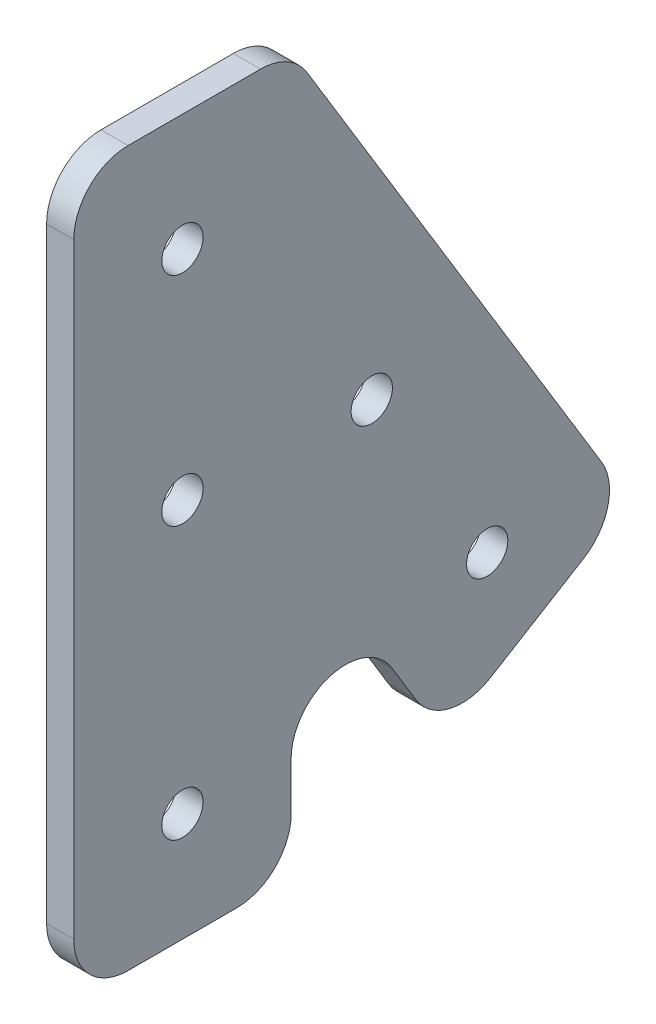
ISO-10303-21;
HEADER;
FILE_DESCRIPTION(('STEP AP214'),'2;1');
FILE_NAME('part.step','',(''),(''),'','','');
FILE_SCHEMA(('AUTOMOTIVE_DESIGN { 1 0 10303 214 1 1 1 1 }'));
ENDSEC;
DATA;
#1=APPLICATION_CONTEXT('core data for automotive mechanical design processes');
#2=APPLICATION_PROTOCOL_DEFINITION('international standard','automotive_design',2000,#1);
#3=PRODUCT_CONTEXT('',#1,'mechanical');
#4=PRODUCT('Part','Part','',(#3));
#5=PRODUCT_RELATED_PRODUCT_CATEGORY('part','',(#4));
#6=PRODUCT_DEFINITION_FORMATION('','',#4);
#7=PRODUCT_DEFINITION_CONTEXT('part definition',#1,'design');
#8=PRODUCT_DEFINITION('design','',#6,#7);
#9=PRODUCT_DEFINITION_SHAPE('','',#8);
#10=(LENGTH_UNIT() NAMED_UNIT(*) SI_UNIT(.MILLI.,.METRE.));
#11=(NAMED_UNIT(*) PLANE_ANGLE_UNIT() SI_UNIT($,.RADIAN.));
#12=(NAMED_UNIT(*) SI_UNIT($,.STERADIAN.) SOLID_ANGLE_UNIT());
#13=UNCERTAINTY_MEASURE_WITH_UNIT(LENGTH_MEASURE(1.E-05),#10,'distance_accuracy_value','');
#14=(GEOMETRIC_REPRESENTATION_CONTEXT(3) GLOBAL_UNCERTAINTY_ASSIGNED_CONTEXT((#13)) GLOBAL_UNIT_ASSIGNED_CONTEXT((#10,
#11,#12)) REPRESENTATION_CONTEXT('',''));
#15=CARTESIAN_POINT('',(0.,0.,0.));
#16=DIRECTION('',(0.,0.,1.));
#17=DIRECTION('',(1.,0.,0.));
#18=AXIS2_PLACEMENT_3D('',#15,#16,#17);
#19=CARTESIAN_POINT('',(3.175,13.9055201207131,-45.3988248074995));
#20=DIRECTION('',(-1.,0.,0.));
#21=DIRECTION('',(0.,0.,1.));
#22=AXIS2_PLACEMENT_3D('',#19,#20,#21);
#23=CYLINDRICAL_SURFACE('',#22,6.35);
#24=CARTESIAN_POINT('',(0.,13.9055201207131,-45.3988248074995));
#25=DIRECTION('',(1.,0.,0.));
#26=DIRECTION('',(0.,0.,-1.));
#27=AXIS2_PLACEMENT_3D('',#24,#25,#26);
#28=CIRCLE('',#27,6.35);
#29=CARTESIAN_POINT('',(0.,10.6075207936335,-39.9724355440406));
#30=VERTEX_POINT('',#29);
#31=CARTESIAN_POINT('',(0.,8.47913085725418,-48.6968241345792));
#32=VERTEX_POINT('',#31);
#33=EDGE_CURVE('E165',#30,#32,#28,.T.);
#34=ORIENTED_EDGE('',*,*,#33,.T.);
#35=DIRECTION('',(-1.,0.,0.));
#36=VECTOR('',#35,1.);
#37=CARTESIAN_POINT('',(3.175,8.47913085725418,-48.6968241345792));
#38=LINE('',#37,#36);
#39=CARTESIAN_POINT('',(3.175,8.47913085725418,-48.6968241345792));
#40=VERTEX_POINT('',#39);
#41=EDGE_CURVE('E11',#40,#32,#38,.T.);
#42=ORIENTED_EDGE('',*,*,#41,.F.);
#43=CARTESIAN_POINT('',(3.175,13.9055201207131,-45.3988248074995));
#44=DIRECTION('',(1.,0.,0.));
#45=DIRECTION('',(0.,0.,-1.));
#46=AXIS2_PLACEMENT_3D('',#43,#44,#45);
#47=CIRCLE('',#46,6.35);
#48=CARTESIAN_POINT('',(3.175,10.6075207936335,-39.9724355440406));
#49=VERTEX_POINT('',#48);
#50=EDGE_CURVE('E192',#49,#40,#47,.T.);
#51=ORIENTED_EDGE('',*,*,#50,.F.);
#52=DIRECTION('',(-1.,0.,0.));
#53=VECTOR('',#52,1.);
#54=CARTESIAN_POINT('',(3.175,10.6075207936335,-39.9724355440406));
#55=LINE('',#54,#53);
#56=EDGE_CURVE('E161',#49,#30,#55,.T.);
#57=ORIENTED_EDGE('',*,*,#56,.T.);
#58=EDGE_LOOP('',(#34,#42,#51,#57));
#59=FACE_BOUND('',#58,.T.);
#60=ADVANCED_FACE('F33',(#59),#23,.T.);
#61=CARTESIAN_POINT('',(3.175,15.0751295114134,-59.5496026614969));
#62=DIRECTION('',(0.,0.854549490308491,0.519369972768448));
#63=DIRECTION('',(0.,-0.519369972768448,0.854549490308491));
#64=AXIS2_PLACEMENT_3D('',#61,#62,#63);
#65=PLANE('',#64);
#66=DIRECTION('',(0.,0.519369972768448,-0.854549490308491));
#67=VECTOR('',#66,1.);
#68=CARTESIAN_POINT('',(0.,15.0751295114134,-59.5496026614969));
#69=LINE('',#68,#67);
#70=CARTESIAN_POINT('',(0.,15.0751295114134,-59.5496026614969));
#71=VERTEX_POINT('',#70);
#72=EDGE_CURVE('E168',#32,#71,#69,.T.);
#73=ORIENTED_EDGE('',*,*,#72,.T.);
#74=DIRECTION('',(-1.,0.,0.));
#75=VECTOR('',#74,1.);
#76=CARTESIAN_POINT('',(3.175,15.0751295114134,-59.5496026614969));
#77=LINE('',#76,#75);
#78=CARTESIAN_POINT('',(3.175,15.0751295114134,-59.5496026614969));
#79=VERTEX_POINT('',#78);
#80=EDGE_CURVE('E41',#79,#71,#77,.T.);
#81=ORIENTED_EDGE('',*,*,#80,.F.);
#82=DIRECTION('',(0.,0.519369972768448,-0.854549490308491));
#83=VECTOR('',#82,1.);
#84=CARTESIAN_POINT('',(3.175,15.0751295114134,-59.5496026614969));
#85=LINE('',#84,#83);
#86=EDGE_CURVE('E110',#40,#79,#85,.T.);
#87=ORIENTED_EDGE('',*,*,#86,.F.);
#88=ORIENTED_EDGE('',*,*,#41,.T.);
#89=EDGE_LOOP('',(#73,#81,#87,#88));
#90=FACE_BOUND('',#89,.T.);
#91=ADVANCED_FACE('F281',(#90),#65,.F.);
#92=CARTESIAN_POINT('',(3.175,20.5015187748724,-56.2516033344173));
#93=DIRECTION('',(-1.,0.,0.));
#94=DIRECTION('',(0.,0.,1.));
#95=AXIS2_PLACEMENT_3D('',#92,#93,#94);
#96=CYLINDRICAL_SURFACE('',#95,6.35);
#97=CARTESIAN_POINT('',(0.,20.5015187748724,-56.2516033344173));
#98=DIRECTION('',(1.,0.,0.));
#99=DIRECTION('',(0.,0.,-1.));
#100=AXIS2_PLACEMENT_3D('',#97,#98,#99);
#101=CIRCLE('',#100,6.35);
#102=CARTESIAN_POINT('',(0.,23.7995181019521,-61.6779925978762));
#103=VERTEX_POINT('',#102);
#104=EDGE_CURVE('E171',#71,#103,#101,.T.);
#105=ORIENTED_EDGE('',*,*,#104,.T.);
#106=DIRECTION('',(-1.,0.,0.));
#107=VECTOR('',#106,1.);
#108=CARTESIAN_POINT('',(3.175,23.7995181019521,-61.6779925978762));
#109=LINE('',#108,#107);
#110=CARTESIAN_POINT('',(3.175,23.7995181019521,-61.6779925978762));
#111=VERTEX_POINT('',#110);
#112=EDGE_CURVE('E217',#111,#103,#109,.T.);
#113=ORIENTED_EDGE('',*,*,#112,.F.);
#114=CARTESIAN_POINT('',(3.175,20.5015187748724,-56.2516033344173));
#115=DIRECTION('',(1.,0.,0.));
#116=DIRECTION('',(0.,0.,-1.));
#117=AXIS2_PLACEMENT_3D('',#114,#115,#116);
#118=CIRCLE('',#117,6.35);
#119=EDGE_CURVE('E225',#79,#111,#118,.T.);
#120=ORIENTED_EDGE('',*,*,#119,.F.);
#121=ORIENTED_EDGE('',*,*,#80,.T.);
#122=EDGE_LOOP('',(#105,#113,#120,#121));
#123=FACE_BOUND('',#122,.T.);
#124=ADVANCED_FACE('F223',(#123),#96,.T.);
#125=CARTESIAN_POINT('',(3.175,80.4377993270796,-27.2549159812988));
#126=DIRECTION('',(0.,-0.51936997276845,0.854549490308489));
#127=DIRECTION('',(0.,-0.85454949030849,-0.51936997276845));
#128=AXIS2_PLACEMENT_3D('',#125,#126,#127);
#129=PLANE('',#128);
#130=DIRECTION('',(0.,0.854549490308489,0.51936997276845));
#131=VECTOR('',#130,1.);
#132=CARTESIAN_POINT('',(0.,80.4377993270796,-27.2549159812988));
#133=LINE('',#132,#131);
#134=CARTESIAN_POINT('',(0.,80.4377993270796,-27.2549159812988));
#135=VERTEX_POINT('',#134);
#136=EDGE_CURVE('E173',#103,#135,#133,.T.);
#137=ORIENTED_EDGE('',*,*,#136,.T.);
#138=DIRECTION('',(-1.,0.,0.));
#139=VECTOR('',#138,1.);
#140=CARTESIAN_POINT('',(3.175,80.4377993270796,-27.2549159812988));
#141=LINE('',#140,#139);
#142=CARTESIAN_POINT('',(3.175,80.4377993270796,-27.2549159812988));
#143=VERTEX_POINT('',#142);
#144=EDGE_CURVE('E214',#143,#135,#141,.T.);
#145=ORIENTED_EDGE('',*,*,#144,.F.);
#146=DIRECTION('',(0.,0.854549490308489,0.51936997276845));
#147=VECTOR('',#146,1.);
#148=CARTESIAN_POINT('',(3.175,80.4377993270796,-27.2549159812988));
#149=LINE('',#148,#147);
#150=EDGE_CURVE('E243',#111,#143,#149,.T.);
#151=ORIENTED_EDGE('',*,*,#150,.F.);
#152=ORIENTED_EDGE('',*,*,#112,.T.);
#153=EDGE_LOOP('',(#137,#145,#151,#152));
#154=FACE_BOUND('',#153,.T.);
#155=ADVANCED_FACE('F234',(#154),#129,.F.);
#156=CARTESIAN_POINT('',(3.175,77.1398,-21.8285267178398));
#157=DIRECTION('',(-1.,0.,0.));
#158=DIRECTION('',(0.,0.,1.));
#159=AXIS2_PLACEMENT_3D('',#156,#157,#158);
#160=CYLINDRICAL_SURFACE('',#159,6.35);
#161=CARTESIAN_POINT('',(0.,77.1398,-21.8285267178398));
#162=DIRECTION('',(1.,0.,0.));
#163=DIRECTION('',(0.,0.,-1.));
#164=AXIS2_PLACEMENT_3D('',#161,#162,#163);
#165=CIRCLE('',#164,6.35);
#166=CARTESIAN_POINT('',(0.,83.4898,-21.8285267178398));
#167=VERTEX_POINT('',#166);
#168=EDGE_CURVE('E175',#135,#167,#165,.T.);
#169=ORIENTED_EDGE('',*,*,#168,.T.);
#170=DIRECTION('',(-1.,0.,0.));
#171=VECTOR('',#170,1.);
#172=CARTESIAN_POINT('',(3.175,83.4898,-21.8285267178398));
#173=LINE('',#172,#171);
#174=CARTESIAN_POINT('',(3.175,83.4898,-21.8285267178398));
#175=VERTEX_POINT('',#174);
#176=EDGE_CURVE('E211',#175,#167,#173,.T.);
#177=ORIENTED_EDGE('',*,*,#176,.F.);
#178=CARTESIAN_POINT('',(3.175,77.1398,-21.8285267178398));
#179=DIRECTION('',(1.,0.,0.));
#180=DIRECTION('',(0.,0.,-1.));
#181=AXIS2_PLACEMENT_3D('',#178,#179,#180);
#182=CIRCLE('',#181,6.35);
#183=EDGE_CURVE('E240',#143,#175,#182,.T.);
#184=ORIENTED_EDGE('',*,*,#183,.F.);
#185=ORIENTED_EDGE('',*,*,#144,.T.);
#186=EDGE_LOOP('',(#169,#177,#184,#185));
#187=FACE_BOUND('',#186,.T.);
#188=ADVANCED_FACE('F238',(#187),#160,.T.);
#189=CARTESIAN_POINT('',(3.175,83.4898,-6.35000000000004));
#190=DIRECTION('',(0.,-1.,0.));
#191=DIRECTION('',(0.,0.,-1.));
#192=AXIS2_PLACEMENT_3D('',#189,#190,#191);
#193=PLANE('',#192);
#194=DIRECTION('',(0.,0.,1.));
#195=VECTOR('',#194,1.);
#196=CARTESIAN_POINT('',(0.,83.4898,-6.35000000000004));
#197=LINE('',#196,#195);
#198=CARTESIAN_POINT('',(0.,83.4898,-6.35000000000004));
#199=VERTEX_POINT('',#198);
#200=EDGE_CURVE('E177',#167,#199,#197,.T.);
#201=ORIENTED_EDGE('',*,*,#200,.T.);
#202=DIRECTION('',(-1.,0.,0.));
#203=VECTOR('',#202,1.);
#204=CARTESIAN_POINT('',(3.175,83.4898,-6.35000000000004));
#205=LINE('',#204,#203);
#206=CARTESIAN_POINT('',(3.175,83.4898,-6.35000000000004));
#207=VERTEX_POINT('',#206);
#208=EDGE_CURVE('E208',#207,#199,#205,.T.);
#209=ORIENTED_EDGE('',*,*,#208,.F.);
#210=DIRECTION('',(0.,0.,1.));
#211=VECTOR('',#210,1.);
#212=CARTESIAN_POINT('',(3.175,83.4898,-6.35000000000004));
#213=LINE('',#212,#211);
#214=EDGE_CURVE('E242',#175,#207,#213,.T.);
#215=ORIENTED_EDGE('',*,*,#214,.F.);
#216=ORIENTED_EDGE('',*,*,#176,.T.);
#217=EDGE_LOOP('',(#201,#209,#215,#216));
#218=FACE_BOUND('',#217,.T.);
#219=ADVANCED_FACE('F294',(#218),#193,.F.);
#220=CARTESIAN_POINT('',(3.175,77.1398,-6.35));
#221=DIRECTION('',(-1.,0.,0.));
#222=DIRECTION('',(0.,0.,1.));
#223=AXIS2_PLACEMENT_3D('',#220,#221,#222);
#224=CYLINDRICAL_SURFACE('',#223,6.35);
#225=CARTESIAN_POINT('',(0.,77.1398,-6.35));
#226=DIRECTION('',(1.,0.,0.));
#227=DIRECTION('',(0.,0.,-1.));
#228=AXIS2_PLACEMENT_3D('',#225,#226,#227);
#229=CIRCLE('',#228,6.35);
#230=CARTESIAN_POINT('',(0.,77.1397999999999,0.));
#231=VERTEX_POINT('',#230);
#232=EDGE_CURVE('E179',#199,#231,#229,.T.);
#233=ORIENTED_EDGE('',*,*,#232,.T.);
#234=DIRECTION('',(-1.,0.,0.));
#235=VECTOR('',#234,1.);
#236=CARTESIAN_POINT('',(3.175,77.1397999999999,0.));
#237=LINE('',#236,#235);
#238=CARTESIAN_POINT('',(3.175,77.1397999999999,0.));
#239=VERTEX_POINT('',#238);
#240=EDGE_CURVE('E205',#239,#231,#237,.T.);
#241=ORIENTED_EDGE('',*,*,#240,.F.);
#242=CARTESIAN_POINT('',(3.175,77.1398,-6.35));
#243=DIRECTION('',(1.,0.,0.));
#244=DIRECTION('',(0.,0.,-1.));
#245=AXIS2_PLACEMENT_3D('',#242,#243,#244);
#246=CIRCLE('',#245,6.35);
#247=EDGE_CURVE('E245',#207,#239,#246,.T.);
#248=ORIENTED_EDGE('',*,*,#247,.F.);
#249=ORIENTED_EDGE('',*,*,#208,.T.);
#250=EDGE_LOOP('',(#233,#241,#248,#249));
#251=FACE_BOUND('',#250,.T.);
#252=ADVANCED_FACE('F297',(#251),#224,.T.);
#253=CARTESIAN_POINT('',(3.175,6.35000000000004,0.));
#254=DIRECTION('',(0.,0.,-1.));
#255=DIRECTION('',(-1.,0.,0.));
#256=AXIS2_PLACEMENT_3D('',#253,#254,#255);
#257=PLANE('',#256);
#258=DIRECTION('',(0.,-1.,0.));
#259=VECTOR('',#258,1.);
#260=CARTESIAN_POINT('',(0.,6.35000000000004,0.));
#261=LINE('',#260,#259);
#262=CARTESIAN_POINT('',(0.,6.35,0.));
#263=VERTEX_POINT('',#262);
#264=EDGE_CURVE('E181',#231,#263,#261,.T.);
#265=ORIENTED_EDGE('',*,*,#264,.T.);
#266=DIRECTION('',(-1.,0.,0.));
#267=VECTOR('',#266,1.);
#268=CARTESIAN_POINT('',(3.175,6.35,0.));
#269=LINE('',#268,#267);
#270=CARTESIAN_POINT('',(3.175,6.35,0.));
#271=VERTEX_POINT('',#270);
#272=EDGE_CURVE('E202',#271,#263,#269,.T.);
#273=ORIENTED_EDGE('',*,*,#272,.F.);
#274=DIRECTION('',(0.,-1.,0.));
#275=VECTOR('',#274,1.);
#276=CARTESIAN_POINT('',(3.175,6.35000000000004,0.));
#277=LINE('',#276,#275);
#278=EDGE_CURVE('E251',#239,#271,#277,.T.);
#279=ORIENTED_EDGE('',*,*,#278,.F.);
#280=ORIENTED_EDGE('',*,*,#240,.T.);
#281=EDGE_LOOP('',(#265,#273,#279,#280));
#282=FACE_BOUND('',#281,.T.);
#283=ADVANCED_FACE('F301',(#282),#257,.F.);
#284=CARTESIAN_POINT('',(3.175,6.35,-6.35));
#285=DIRECTION('',(-1.,0.,0.));
#286=DIRECTION('',(0.,0.,1.));
#287=AXIS2_PLACEMENT_3D('',#284,#285,#286);
#288=CYLINDRICAL_SURFACE('',#287,6.35);
#289=CARTESIAN_POINT('',(0.,6.35,-6.35));
#290=DIRECTION('',(1.,0.,0.));
#291=DIRECTION('',(0.,0.,1.));
#292=AXIS2_PLACEMENT_3D('',#289,#290,#291);
#293=CIRCLE('',#292,6.35);
#294=CARTESIAN_POINT('',(0.,0.,-6.35000000000004));
#295=VERTEX_POINT('',#294);
#296=EDGE_CURVE('E183',#263,#295,#293,.T.);
#297=ORIENTED_EDGE('',*,*,#296,.T.);
#298=DIRECTION('',(-1.,0.,0.));
#299=VECTOR('',#298,1.);
#300=CARTESIAN_POINT('',(3.175,0.,-6.35000000000004));
#301=LINE('',#300,#299);
#302=CARTESIAN_POINT('',(3.175,0.,-6.35000000000004));
#303=VERTEX_POINT('',#302);
#304=EDGE_CURVE('E199',#303,#295,#301,.T.);
#305=ORIENTED_EDGE('',*,*,#304,.F.);
#306=CARTESIAN_POINT('',(3.175,6.35,-6.35));
#307=DIRECTION('',(1.,0.,0.));
#308=DIRECTION('',(0.,0.,1.));
#309=AXIS2_PLACEMENT_3D('',#306,#307,#308);
#310=CIRCLE('',#309,6.35);
#311=EDGE_CURVE('E253',#271,#303,#310,.T.);
#312=ORIENTED_EDGE('',*,*,#311,.F.);
#313=ORIENTED_EDGE('',*,*,#272,.T.);
#314=EDGE_LOOP('',(#297,#305,#312,#313));
#315=FACE_BOUND('',#314,.T.);
#316=ADVANCED_FACE('F305',(#315),#288,.T.);
#317=CARTESIAN_POINT('',(3.175,0.,-6.35000000000004));
#318=DIRECTION('',(0.,1.,0.));
#319=DIRECTION('',(0.,0.,1.));
#320=AXIS2_PLACEMENT_3D('',#317,#318,#319);
#321=PLANE('',#320);
#322=DIRECTION('',(0.,0.,-1.));
#323=VECTOR('',#322,1.);
#324=CARTESIAN_POINT('',(0.,0.,-6.35000000000004));
#325=LINE('',#324,#323);
#326=CARTESIAN_POINT('',(0.,0.,-19.05));
#327=VERTEX_POINT('',#326);
#328=EDGE_CURVE('E185',#295,#327,#325,.T.);
#329=ORIENTED_EDGE('',*,*,#328,.T.);
#330=DIRECTION('',(-1.,0.,0.));
#331=VECTOR('',#330,1.);
#332=CARTESIAN_POINT('',(3.175,0.,-19.05));
#333=LINE('',#332,#331);
#334=CARTESIAN_POINT('',(3.175,0.,-19.05));
#335=VERTEX_POINT('',#334);
#336=EDGE_CURVE('E196',#335,#327,#333,.T.);
#337=ORIENTED_EDGE('',*,*,#336,.F.);
#338=DIRECTION('',(0.,0.,-1.));
#339=VECTOR('',#338,1.);
#340=CARTESIAN_POINT('',(3.175,0.,-6.35000000000004));
#341=LINE('',#340,#339);
#342=EDGE_CURVE('E255',#303,#335,#341,.T.);
#343=ORIENTED_EDGE('',*,*,#342,.F.);
#344=ORIENTED_EDGE('',*,*,#304,.T.);
#345=EDGE_LOOP('',(#329,#337,#343,#344));
#346=FACE_BOUND('',#345,.T.);
#347=ADVANCED_FACE('F261',(#346),#321,.F.);
#348=CARTESIAN_POINT('',(3.175,6.35,-19.05));
#349=DIRECTION('',(-1.,0.,0.));
#350=DIRECTION('',(0.,0.,1.));
#351=AXIS2_PLACEMENT_3D('',#348,#349,#350);
#352=CYLINDRICAL_SURFACE('',#351,6.35);
#353=CARTESIAN_POINT('',(0.,6.35,-19.05));
#354=DIRECTION('',(1.,0.,0.));
#355=DIRECTION('',(0.,0.,-1.));
#356=AXIS2_PLACEMENT_3D('',#353,#354,#355);
#357=CIRCLE('',#356,6.35);
#358=CARTESIAN_POINT('',(0.,6.35000000000004,-25.4));
#359=VERTEX_POINT('',#358);
#360=EDGE_CURVE('E187',#327,#359,#357,.T.);
#361=ORIENTED_EDGE('',*,*,#360,.T.);
#362=DIRECTION('',(-1.,0.,0.));
#363=VECTOR('',#362,1.);
#364=CARTESIAN_POINT('',(3.175,6.35000000000004,-25.4));
#365=LINE('',#364,#363);
#366=CARTESIAN_POINT('',(3.175,6.35000000000004,-25.4));
#367=VERTEX_POINT('',#366);
#368=EDGE_CURVE('E156',#367,#359,#365,.T.);
#369=ORIENTED_EDGE('',*,*,#368,.F.);
#370=CARTESIAN_POINT('',(3.175,6.35,-19.05));
#371=DIRECTION('',(1.,0.,0.));
#372=DIRECTION('',(0.,0.,-1.));
#373=AXIS2_PLACEMENT_3D('',#370,#371,#372);
#374=CIRCLE('',#373,6.35);
#375=EDGE_CURVE('E147',#335,#367,#374,.T.);
#376=ORIENTED_EDGE('',*,*,#375,.F.);
#377=ORIENTED_EDGE('',*,*,#336,.T.);
#378=EDGE_LOOP('',(#361,#369,#376,#377));
#379=FACE_BOUND('',#378,.T.);
#380=ADVANCED_FACE('F265',(#379),#352,.T.);
#381=CARTESIAN_POINT('',(3.175,6.35000000000004,-25.4));
#382=DIRECTION('',(0.,0.,1.));
#383=DIRECTION('',(1.,0.,0.));
#384=AXIS2_PLACEMENT_3D('',#381,#382,#383);
#385=PLANE('',#384);
#386=DIRECTION('',(0.,1.,0.));
#387=VECTOR('',#386,1.);
#388=CARTESIAN_POINT('',(0.,6.35000000000004,-25.4));
#389=LINE('',#388,#387);
#390=CARTESIAN_POINT('',(0.,11.9100183170237,-25.4));
#391=VERTEX_POINT('',#390);
#392=EDGE_CURVE('E155',#359,#391,#389,.T.);
#393=ORIENTED_EDGE('',*,*,#392,.T.);
#394=DIRECTION('',(-1.,0.,0.));
#395=VECTOR('',#394,1.);
#396=CARTESIAN_POINT('',(3.175,11.9100183170237,-25.4));
#397=LINE('',#396,#395);
#398=CARTESIAN_POINT('',(3.175,11.9100183170237,-25.4));
#399=VERTEX_POINT('',#398);
#400=EDGE_CURVE('E152',#399,#391,#397,.T.);
#401=ORIENTED_EDGE('',*,*,#400,.F.);
#402=DIRECTION('',(0.,1.,0.));
#403=VECTOR('',#402,1.);
#404=CARTESIAN_POINT('',(3.175,6.35000000000004,-25.4));
#405=LINE('',#404,#403);
#406=EDGE_CURVE('E141',#367,#399,#405,.T.);
#407=ORIENTED_EDGE('',*,*,#406,.F.);
#408=ORIENTED_EDGE('',*,*,#368,.T.);
#409=EDGE_LOOP('',(#393,#401,#407,#408));
#410=FACE_BOUND('',#409,.T.);
#411=ADVANCED_FACE('F153',(#410),#385,.F.);
#412=CARTESIAN_POINT('',(3.175,11.910018317024,-31.75));
#413=DIRECTION('',(-1.,0.,0.));
#414=DIRECTION('',(0.,0.,1.));
#415=AXIS2_PLACEMENT_3D('',#412,#413,#414);
#416=CYLINDRICAL_SURFACE('',#415,6.35);
#417=CARTESIAN_POINT('',(0.,11.910018317024,-31.75));
#418=DIRECTION('',(-1.,0.,0.));
#419=DIRECTION('',(0.,0.,-1.));
#420=AXIS2_PLACEMENT_3D('',#417,#418,#419);
#421=CIRCLE('',#420,6.35);
#422=CARTESIAN_POINT('',(0.,15.2080176441034,-37.1763892634591));
#423=VERTEX_POINT('',#422);
#424=EDGE_CURVE('E96',#391,#423,#421,.T.);
#425=ORIENTED_EDGE('',*,*,#424,.T.);
#426=DIRECTION('',(-1.,0.,0.));
#427=VECTOR('',#426,1.);
#428=CARTESIAN_POINT('',(3.175,15.2080176441034,-37.1763892634591));
#429=LINE('',#428,#427);
#430=CARTESIAN_POINT('',(3.175,15.2080176441034,-37.1763892634591));
#431=VERTEX_POINT('',#430);
#432=EDGE_CURVE('E157',#431,#423,#429,.T.);
#433=ORIENTED_EDGE('',*,*,#432,.F.);
#434=CARTESIAN_POINT('',(3.175,11.910018317024,-31.75));
#435=DIRECTION('',(-1.,0.,0.));
#436=DIRECTION('',(0.,0.,-1.));
#437=AXIS2_PLACEMENT_3D('',#434,#435,#436);
#438=CIRCLE('',#437,6.35);
#439=EDGE_CURVE('E145',#399,#431,#438,.T.);
#440=ORIENTED_EDGE('',*,*,#439,.F.);
#441=ORIENTED_EDGE('',*,*,#400,.T.);
#442=EDGE_LOOP('',(#425,#433,#440,#441));
#443=FACE_BOUND('',#442,.T.);
#444=ADVANCED_FACE('F159',(#443),#416,.F.);
#445=CARTESIAN_POINT('',(3.175,10.6075207936335,-39.9724355440406));
#446=DIRECTION('',(0.,0.519369972768447,-0.854549490308491));
#447=DIRECTION('',(0.,0.854549490308491,0.519369972768447));
#448=AXIS2_PLACEMENT_3D('',#445,#446,#447);
#449=PLANE('',#448);
#450=DIRECTION('',(0.,-0.854549490308491,-0.519369972768447));
#451=VECTOR('',#450,1.);
#452=CARTESIAN_POINT('',(0.,10.6075207936335,-39.9724355440406));
#453=LINE('',#452,#451);
#454=EDGE_CURVE('E102',#423,#30,#453,.T.);
#455=ORIENTED_EDGE('',*,*,#454,.T.);
#456=ORIENTED_EDGE('',*,*,#56,.F.);
#457=DIRECTION('',(0.,-0.854549490308491,-0.519369972768447));
#458=VECTOR('',#457,1.);
#459=CARTESIAN_POINT('',(3.175,10.6075207936335,-39.9724355440406));
#460=LINE('',#459,#458);
#461=EDGE_CURVE('E49',#431,#49,#460,.T.);
#462=ORIENTED_EDGE('',*,*,#461,.F.);
#463=ORIENTED_EDGE('',*,*,#432,.T.);
#464=EDGE_LOOP('',(#455,#456,#462,#463));
#465=FACE_BOUND('',#464,.T.);
#466=ADVANCED_FACE('F269',(#465),#449,.F.);
#467=CARTESIAN_POINT('',(3.175,13.9055201207131,-45.3988248074995));
#468=DIRECTION('',(1.,0.,0.));
#469=DIRECTION('',(0.,0.,-1.));
#470=AXIS2_PLACEMENT_3D('',#467,#468,#469);
#471=PLANE('',#470);
#472=CARTESIAN_POINT('',(3.175,12.7,-12.7));
#473=DIRECTION('',(1.,0.,0.));
#474=DIRECTION('',(0.,0.,-1.));
#475=AXIS2_PLACEMENT_3D('',#472,#473,#474);
#476=CIRCLE('',#475,2.413);
#477=CARTESIAN_POINT('',(3.175,12.7,-15.113));
#478=VERTEX_POINT('',#477);
#479=EDGE_CURVE('E400',#478,#478,#476,.T.);
#480=ORIENTED_EDGE('',*,*,#479,.F.);
#481=EDGE_LOOP('',(#480));
#482=FACE_BOUND('',#481,.T.);
#483=CARTESIAN_POINT('',(3.175,44.45,-12.7));
#484=DIRECTION('',(1.,0.,0.));
#485=DIRECTION('',(0.,0.,-1.));
#486=AXIS2_PLACEMENT_3D('',#483,#484,#485);
#487=CIRCLE('',#486,2.413);
#488=CARTESIAN_POINT('',(3.175,44.45,-15.113));
#489=VERTEX_POINT('',#488);
#490=EDGE_CURVE('E405',#489,#489,#487,.T.);
#491=ORIENTED_EDGE('',*,*,#490,.F.);
#492=EDGE_LOOP('',(#491));
#493=FACE_BOUND('',#492,.T.);
#494=CARTESIAN_POINT('',(3.175,69.85,-12.7));
#495=DIRECTION('',(1.,0.,0.));
#496=DIRECTION('',(0.,0.,-1.));
#497=AXIS2_PLACEMENT_3D('',#494,#495,#496);
#498=CIRCLE('',#497,2.413);
#499=CARTESIAN_POINT('',(3.175,69.85,-15.113));
#500=VERTEX_POINT('',#499);
#501=EDGE_CURVE('E413',#500,#500,#498,.T.);
#502=ORIENTED_EDGE('',*,*,#501,.F.);
#503=EDGE_LOOP('',(#502));
#504=FACE_BOUND('',#503,.T.);
#505=CARTESIAN_POINT('',(3.175,43.5351759212054,-34.8216099957777));
#506=DIRECTION('',(1.,0.,0.));
#507=DIRECTION('',(0.,0.,-1.));
#508=AXIS2_PLACEMENT_3D('',#505,#506,#507);
#509=CIRCLE('',#508,2.41299999999999);
#510=CARTESIAN_POINT('',(3.175,43.5351759212054,-37.2346099957777));
#511=VERTEX_POINT('',#510);
#512=EDGE_CURVE('E419',#511,#511,#509,.T.);
#513=ORIENTED_EDGE('',*,*,#512,.F.);
#514=EDGE_LOOP('',(#513));
#515=FACE_BOUND('',#514,.T.);
#516=CARTESIAN_POINT('',(3.175,21.3427643310938,-48.3095031300438));
#517=DIRECTION('',(1.,0.,0.));
#518=DIRECTION('',(0.,0.,-1.));
#519=AXIS2_PLACEMENT_3D('',#516,#517,#518);
#520=CIRCLE('',#519,2.413);
#521=CARTESIAN_POINT('',(3.175,21.3427643310938,-50.7225031300438));
#522=VERTEX_POINT('',#521);
#523=EDGE_CURVE('E425',#522,#522,#520,.T.);
#524=ORIENTED_EDGE('',*,*,#523,.F.);
#525=EDGE_LOOP('',(#524));
#526=FACE_BOUND('',#525,.T.);
#527=ORIENTED_EDGE('',*,*,#50,.T.);
#528=ORIENTED_EDGE('',*,*,#86,.T.);
#529=ORIENTED_EDGE('',*,*,#119,.T.);
#530=ORIENTED_EDGE('',*,*,#150,.T.);
#531=ORIENTED_EDGE('',*,*,#183,.T.);
#532=ORIENTED_EDGE('',*,*,#214,.T.);
#533=ORIENTED_EDGE('',*,*,#247,.T.);
#534=ORIENTED_EDGE('',*,*,#278,.T.);
#535=ORIENTED_EDGE('',*,*,#311,.T.);
#536=ORIENTED_EDGE('',*,*,#342,.T.);
#537=ORIENTED_EDGE('',*,*,#375,.T.);
#538=ORIENTED_EDGE('',*,*,#406,.T.);
#539=ORIENTED_EDGE('',*,*,#439,.T.);
#540=ORIENTED_EDGE('',*,*,#461,.T.);
#541=EDGE_LOOP('',(#527,#528,#529,#530,#531,#532,#533,#534,#535,#536,#537,#538,#539,#540));
#542=FACE_BOUND('',#541,.T.);
#543=ADVANCED_FACE('F143',(#482,#493,#504,#515,#526,#542),#471,.T.);
#544=CARTESIAN_POINT('',(0.,13.9055201207131,-45.3988248074995));
#545=DIRECTION('',(1.,0.,0.));
#546=DIRECTION('',(0.,0.,-1.));
#547=AXIS2_PLACEMENT_3D('',#544,#545,#546);
#548=PLANE('',#547);
#549=CARTESIAN_POINT('',(0.,12.7,-12.7));
#550=DIRECTION('',(1.,0.,0.));
#551=DIRECTION('',(0.,0.,-1.));
#552=AXIS2_PLACEMENT_3D('',#549,#550,#551);
#553=CIRCLE('',#552,2.413);
#554=CARTESIAN_POINT('',(0.,12.7,-15.113));
#555=VERTEX_POINT('',#554);
#556=EDGE_CURVE('E169',#555,#555,#553,.T.);
#557=ORIENTED_EDGE('',*,*,#556,.T.);
#558=EDGE_LOOP('',(#557));
#559=FACE_BOUND('',#558,.T.);
#560=CARTESIAN_POINT('',(0.,44.45,-12.7));
#561=DIRECTION('',(1.,0.,0.));
#562=DIRECTION('',(0.,0.,-1.));
#563=AXIS2_PLACEMENT_3D('',#560,#561,#562);
#564=CIRCLE('',#563,2.413);
#565=CARTESIAN_POINT('',(0.,44.45,-15.113));
#566=VERTEX_POINT('',#565);
#567=EDGE_CURVE('E401',#566,#566,#564,.T.);
#568=ORIENTED_EDGE('',*,*,#567,.T.);
#569=EDGE_LOOP('',(#568));
#570=FACE_BOUND('',#569,.T.);
#571=CARTESIAN_POINT('',(0.,69.85,-12.7));
#572=DIRECTION('',(1.,0.,0.));
#573=DIRECTION('',(0.,0.,-1.));
#574=AXIS2_PLACEMENT_3D('',#571,#572,#573);
#575=CIRCLE('',#574,2.413);
#576=CARTESIAN_POINT('',(0.,69.85,-15.113));
#577=VERTEX_POINT('',#576);
#578=EDGE_CURVE('E410',#577,#577,#575,.T.);
#579=ORIENTED_EDGE('',*,*,#578,.T.);
#580=EDGE_LOOP('',(#579));
#581=FACE_BOUND('',#580,.T.);
#582=CARTESIAN_POINT('',(0.,43.5351759212054,-34.8216099957777));
#583=DIRECTION('',(1.,0.,0.));
#584=DIRECTION('',(0.,0.,-1.));
#585=AXIS2_PLACEMENT_3D('',#582,#583,#584);
#586=CIRCLE('',#585,2.41299999999999);
#587=CARTESIAN_POINT('',(0.,43.5351759212054,-37.2346099957777));
#588=VERTEX_POINT('',#587);
#589=EDGE_CURVE('E416',#588,#588,#586,.T.);
#590=ORIENTED_EDGE('',*,*,#589,.T.);
#591=EDGE_LOOP('',(#590));
#592=FACE_BOUND('',#591,.T.);
#593=CARTESIAN_POINT('',(0.,21.3427643310938,-48.3095031300438));
#594=DIRECTION('',(1.,0.,0.));
#595=DIRECTION('',(0.,0.,-1.));
#596=AXIS2_PLACEMENT_3D('',#593,#594,#595);
#597=CIRCLE('',#596,2.413);
#598=CARTESIAN_POINT('',(0.,21.3427643310938,-50.7225031300438));
#599=VERTEX_POINT('',#598);
#600=EDGE_CURVE('E422',#599,#599,#597,.T.);
#601=ORIENTED_EDGE('',*,*,#600,.T.);
#602=EDGE_LOOP('',(#601));
#603=FACE_BOUND('',#602,.T.);
#604=ORIENTED_EDGE('',*,*,#33,.F.);
#605=ORIENTED_EDGE('',*,*,#454,.F.);
#606=ORIENTED_EDGE('',*,*,#424,.F.);
#607=ORIENTED_EDGE('',*,*,#392,.F.);
#608=ORIENTED_EDGE('',*,*,#360,.F.);
#609=ORIENTED_EDGE('',*,*,#328,.F.);
#610=ORIENTED_EDGE('',*,*,#296,.F.);
#611=ORIENTED_EDGE('',*,*,#264,.F.);
#612=ORIENTED_EDGE('',*,*,#232,.F.);
#613=ORIENTED_EDGE('',*,*,#200,.F.);
#614=ORIENTED_EDGE('',*,*,#168,.F.);
#615=ORIENTED_EDGE('',*,*,#136,.F.);
#616=ORIENTED_EDGE('',*,*,#104,.F.);
#617=ORIENTED_EDGE('',*,*,#72,.F.);
#618=EDGE_LOOP('',(#604,#605,#606,#607,#608,#609,#610,#611,#612,#613,#614,#615,#616,#617));
#619=FACE_BOUND('',#618,.T.);
#620=ADVANCED_FACE('F229',(#559,#570,#581,#592,#603,#619),#548,.F.);
#621=CARTESIAN_POINT('',(0.,21.3427643310938,-48.3095031300438));
#622=DIRECTION('',(1.,0.,0.));
#623=DIRECTION('',(0.,0.,-1.));
#624=AXIS2_PLACEMENT_3D('',#621,#622,#623);
#625=CYLINDRICAL_SURFACE('',#624,2.413);
#626=ORIENTED_EDGE('',*,*,#600,.F.);
#627=EDGE_LOOP('',(#626));
#628=FACE_BOUND('',#627,.T.);
#629=ORIENTED_EDGE('',*,*,#523,.T.);
#630=EDGE_LOOP('',(#629));
#631=FACE_BOUND('',#630,.T.);
#632=ADVANCED_FACE('F342',(#628,#631),#625,.F.);
#633=CARTESIAN_POINT('',(0.,43.5351759212054,-34.8216099957777));
#634=DIRECTION('',(1.,0.,0.));
#635=DIRECTION('',(0.,0.,-1.));
#636=AXIS2_PLACEMENT_3D('',#633,#634,#635);
#637=CYLINDRICAL_SURFACE('',#636,2.41299999999999);
#638=ORIENTED_EDGE('',*,*,#589,.F.);
#639=EDGE_LOOP('',(#638));
#640=FACE_BOUND('',#639,.T.);
#641=ORIENTED_EDGE('',*,*,#512,.T.);
#642=EDGE_LOOP('',(#641));
#643=FACE_BOUND('',#642,.T.);
#644=ADVANCED_FACE('F351',(#640,#643),#637,.F.);
#645=CARTESIAN_POINT('',(0.,69.85,-12.7));
#646=DIRECTION('',(1.,0.,0.));
#647=DIRECTION('',(0.,0.,-1.));
#648=AXIS2_PLACEMENT_3D('',#645,#646,#647);
#649=CYLINDRICAL_SURFACE('',#648,2.413);
#650=ORIENTED_EDGE('',*,*,#578,.F.);
#651=EDGE_LOOP('',(#650));
#652=FACE_BOUND('',#651,.T.);
#653=ORIENTED_EDGE('',*,*,#501,.T.);
#654=EDGE_LOOP('',(#653));
#655=FACE_BOUND('',#654,.T.);
#656=ADVANCED_FACE('F361',(#652,#655),#649,.F.);
#657=CARTESIAN_POINT('',(0.,44.45,-12.7));
#658=DIRECTION('',(1.,0.,0.));
#659=DIRECTION('',(0.,0.,-1.));
#660=AXIS2_PLACEMENT_3D('',#657,#658,#659);
#661=CYLINDRICAL_SURFACE('',#660,2.413);
#662=ORIENTED_EDGE('',*,*,#567,.F.);
#663=EDGE_LOOP('',(#662));
#664=FACE_BOUND('',#663,.T.);
#665=ORIENTED_EDGE('',*,*,#490,.T.);
#666=EDGE_LOOP('',(#665));
#667=FACE_BOUND('',#666,.T.);
#668=ADVANCED_FACE('F371',(#664,#667),#661,.F.);
#669=CARTESIAN_POINT('',(0.,12.7,-12.7));
#670=DIRECTION('',(1.,0.,0.));
#671=DIRECTION('',(0.,0.,-1.));
#672=AXIS2_PLACEMENT_3D('',#669,#670,#671);
#673=CYLINDRICAL_SURFACE('',#672,2.413);
#674=ORIENTED_EDGE('',*,*,#556,.F.);
#675=EDGE_LOOP('',(#674));
#676=FACE_BOUND('',#675,.T.);
#677=ORIENTED_EDGE('',*,*,#479,.T.);
#678=EDGE_LOOP('',(#677));
#679=FACE_BOUND('',#678,.T.);
#680=ADVANCED_FACE('F381',(#676,#679),#673,.F.);
#681=CLOSED_SHELL('',(#60,#91,#124,#155,#188,#219,#252,#283,#316,#347,#380,#411,#444,#466,#543,
#620,#632,#644,#656,#668,#680));
#682=MANIFOLD_SOLID_BREP('B2',#681);
#683=ADVANCED_BREP_SHAPE_REPRESENTATION('',(#18,#682),#14);
#684=SHAPE_DEFINITION_REPRESENTATION(#9,#683);
ENDSEC;
END-ISO-10303-21;
